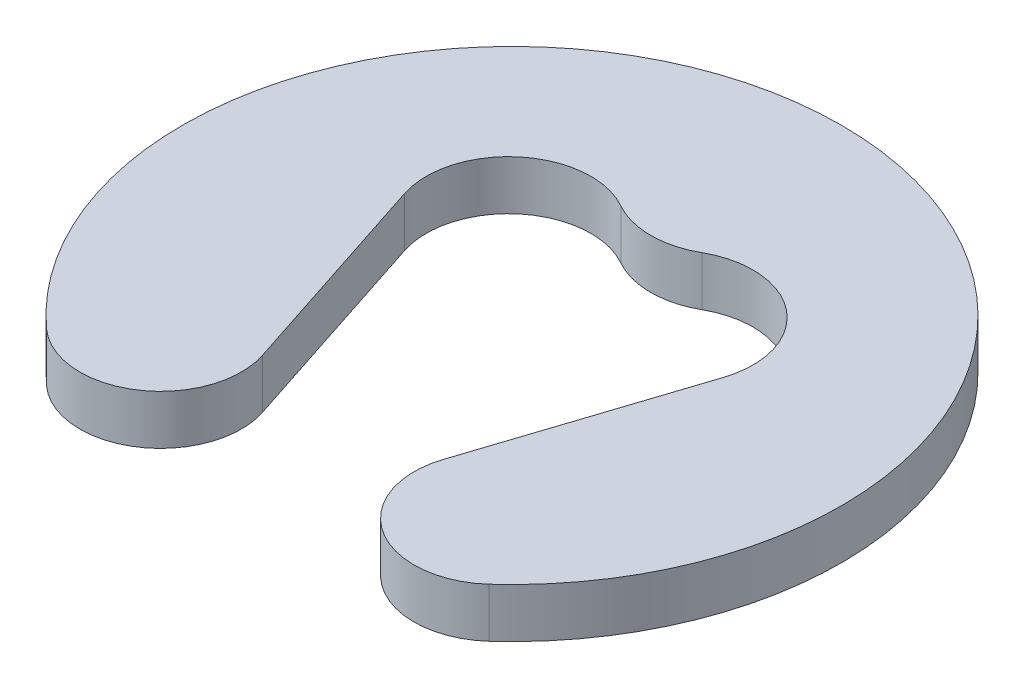
ISO-10303-21;
HEADER;
FILE_DESCRIPTION(('STEP AP214'),'2;1');
FILE_NAME('part.step','',(''),(''),'','','');
FILE_SCHEMA(('AUTOMOTIVE_DESIGN { 1 0 10303 214 1 1 1 1 }'));
ENDSEC;
DATA;
#1=APPLICATION_CONTEXT('core data for automotive mechanical design processes');
#2=APPLICATION_PROTOCOL_DEFINITION('international standard','automotive_design',2000,#1);
#3=PRODUCT_CONTEXT('',#1,'mechanical');
#4=PRODUCT('Part','Part','',(#3));
#5=PRODUCT_RELATED_PRODUCT_CATEGORY('part','',(#4));
#6=PRODUCT_DEFINITION_FORMATION('','',#4);
#7=PRODUCT_DEFINITION_CONTEXT('part definition',#1,'design');
#8=PRODUCT_DEFINITION('design','',#6,#7);
#9=PRODUCT_DEFINITION_SHAPE('','',#8);
#10=(LENGTH_UNIT() NAMED_UNIT(*) SI_UNIT(.MILLI.,.METRE.));
#11=(NAMED_UNIT(*) PLANE_ANGLE_UNIT() SI_UNIT($,.RADIAN.));
#12=(NAMED_UNIT(*) SI_UNIT($,.STERADIAN.) SOLID_ANGLE_UNIT());
#13=UNCERTAINTY_MEASURE_WITH_UNIT(LENGTH_MEASURE(1.E-05),#10,'distance_accuracy_value','');
#14=(GEOMETRIC_REPRESENTATION_CONTEXT(3) GLOBAL_UNCERTAINTY_ASSIGNED_CONTEXT((#13)) GLOBAL_UNIT_ASSIGNED_CONTEXT((#10,
#11,#12)) REPRESENTATION_CONTEXT('',''));
#15=CARTESIAN_POINT('',(0.,0.,0.));
#16=DIRECTION('',(0.,0.,1.));
#17=DIRECTION('',(1.,0.,0.));
#18=AXIS2_PLACEMENT_3D('',#15,#16,#17);
#19=CARTESIAN_POINT('',(0.,0.15,0.));
#20=DIRECTION('',(0.,1.,0.));
#21=DIRECTION('',(0.,0.,1.));
#22=AXIS2_PLACEMENT_3D('',#19,#20,#21);
#23=PLANE('',#22);
#24=CARTESIAN_POINT('',(0.,0.15,0.));
#25=DIRECTION('',(0.,1.,0.));
#26=DIRECTION('',(0.,0.,1.));
#27=AXIS2_PLACEMENT_3D('',#24,#25,#26);
#28=CIRCLE('',#27,2.);
#29=CARTESIAN_POINT('',(1.34323827989153,0.15,1.48179314461703));
#30=VERTEX_POINT('',#29);
#31=CARTESIAN_POINT('',(-1.34323827989153,0.15,1.48179314461703));
#32=VERTEX_POINT('',#31);
#33=EDGE_CURVE('E12',#30,#32,#28,.T.);
#34=ORIENTED_EDGE('',*,*,#33,.T.);
#35=CARTESIAN_POINT('',(-1.01399050348684,0.15,1.11858350023713));
#36=DIRECTION('',(0.,1.,0.));
#37=DIRECTION('',(0.,0.,1.));
#38=AXIS2_PLACEMENT_3D('',#35,#36,#37);
#39=CIRCLE('',#38,0.490229888968448);
#40=CARTESIAN_POINT('',(-0.548029650751403,0.15,0.966248908774503));
#41=VERTEX_POINT('',#40);
#42=EDGE_CURVE('E90',#32,#41,#39,.T.);
#43=ORIENTED_EDGE('',*,*,#42,.T.);
#44=DIRECTION('',(-0.310741133681523,0.,-0.950494580646477));
#45=VECTOR('',#44,1.);
#46=CARTESIAN_POINT('',(-0.780500995815256,0.15,0.255165857036482));
#47=LINE('',#46,#45);
#48=CARTESIAN_POINT('',(-0.967148548190199,0.15,-0.315751436472322));
#49=VERTEX_POINT('',#48);
#50=EDGE_CURVE('E154',#41,#49,#47,.T.);
#51=ORIENTED_EDGE('',*,*,#50,.T.);
#52=CARTESIAN_POINT('',(-0.49190125786696,0.15,-0.471122003313084));
#53=DIRECTION('',(0.,1.,0.));
#54=DIRECTION('',(0.,0.,1.));
#55=AXIS2_PLACEMENT_3D('',#52,#53,#54);
#56=CIRCLE('',#55,0.5);
#57=CARTESIAN_POINT('',(-0.24595062893348,0.15,-0.906447500070654));
#58=VERTEX_POINT('',#57);
#59=EDGE_CURVE('E127',#58,#49,#56,.T.);
#60=ORIENTED_EDGE('',*,*,#59,.F.);
#61=CARTESIAN_POINT('',(0.,0.15,-1.34177299682823));
#62=DIRECTION('',(0.,1.,0.));
#63=DIRECTION('',(0.,0.,1.));
#64=AXIS2_PLACEMENT_3D('',#61,#62,#63);
#65=CIRCLE('',#64,0.5);
#66=CARTESIAN_POINT('',(0.24595062893348,0.15,-0.906447500070654));
#67=VERTEX_POINT('',#66);
#68=EDGE_CURVE('E150',#58,#67,#65,.T.);
#69=ORIENTED_EDGE('',*,*,#68,.T.);
#70=CARTESIAN_POINT('',(0.49190125786696,0.15,-0.471122003313084));
#71=DIRECTION('',(0.,1.,0.));
#72=DIRECTION('',(0.,0.,1.));
#73=AXIS2_PLACEMENT_3D('',#70,#71,#72);
#74=CIRCLE('',#73,0.5);
#75=CARTESIAN_POINT('',(0.967148548190199,0.15,-0.315751436472322));
#76=VERTEX_POINT('',#75);
#77=EDGE_CURVE('E147',#67,#76,#74,.F.);
#78=ORIENTED_EDGE('',*,*,#77,.T.);
#79=DIRECTION('',(0.310741133681523,0.,-0.950494580646477));
#80=VECTOR('',#79,1.);
#81=CARTESIAN_POINT('',(0.780500995815256,0.15,0.255165857036482));
#82=LINE('',#81,#80);
#83=CARTESIAN_POINT('',(0.548029650751403,0.15,0.966248908774503));
#84=VERTEX_POINT('',#83);
#85=EDGE_CURVE('E144',#84,#76,#82,.T.);
#86=ORIENTED_EDGE('',*,*,#85,.F.);
#87=CARTESIAN_POINT('',(1.01399050348684,0.15,1.11858350023713));
#88=DIRECTION('',(0.,1.,0.));
#89=DIRECTION('',(0.,0.,1.));
#90=AXIS2_PLACEMENT_3D('',#87,#88,#89);
#91=CIRCLE('',#90,0.490229888968448);
#92=EDGE_CURVE('E141',#30,#84,#91,.F.);
#93=ORIENTED_EDGE('',*,*,#92,.F.);
#94=EDGE_LOOP('',(#34,#43,#51,#60,#69,#78,#86,#93));
#95=FACE_BOUND('',#94,.T.);
#96=ADVANCED_FACE('F38',(#95),#23,.T.);
#97=CARTESIAN_POINT('',(0.,-0.15,0.));
#98=DIRECTION('',(0.,1.,0.));
#99=DIRECTION('',(0.,0.,1.));
#100=AXIS2_PLACEMENT_3D('',#97,#98,#99);
#101=PLANE('',#100);
#102=CARTESIAN_POINT('',(-1.01399050348684,-0.15,1.11858350023713));
#103=DIRECTION('',(0.,1.,0.));
#104=DIRECTION('',(0.,0.,1.));
#105=AXIS2_PLACEMENT_3D('',#102,#103,#104);
#106=CIRCLE('',#105,0.490229888968448);
#107=CARTESIAN_POINT('',(-1.34323827989153,-0.15,1.48179314461703));
#108=VERTEX_POINT('',#107);
#109=CARTESIAN_POINT('',(-0.548029650751403,-0.15,0.966248908774503));
#110=VERTEX_POINT('',#109);
#111=EDGE_CURVE('E119',#108,#110,#106,.T.);
#112=ORIENTED_EDGE('',*,*,#111,.F.);
#113=CARTESIAN_POINT('',(0.,-0.15,0.));
#114=DIRECTION('',(0.,1.,0.));
#115=DIRECTION('',(0.,0.,1.));
#116=AXIS2_PLACEMENT_3D('',#113,#114,#115);
#117=CIRCLE('',#116,2.);
#118=CARTESIAN_POINT('',(1.34323827989153,-0.15,1.48179314461703));
#119=VERTEX_POINT('',#118);
#120=EDGE_CURVE('E42',#119,#108,#117,.T.);
#121=ORIENTED_EDGE('',*,*,#120,.F.);
#122=CARTESIAN_POINT('',(1.01399050348684,-0.15,1.11858350023713));
#123=DIRECTION('',(0.,1.,0.));
#124=DIRECTION('',(0.,0.,1.));
#125=AXIS2_PLACEMENT_3D('',#122,#123,#124);
#126=CIRCLE('',#125,0.490229888968448);
#127=CARTESIAN_POINT('',(0.548029650751402,-0.15,0.966248908774503));
#128=VERTEX_POINT('',#127);
#129=EDGE_CURVE('E96',#119,#128,#126,.F.);
#130=ORIENTED_EDGE('',*,*,#129,.T.);
#131=DIRECTION('',(0.310741133681523,0.,-0.950494580646477));
#132=VECTOR('',#131,1.);
#133=CARTESIAN_POINT('',(0.780500995815256,-0.15,0.255165857036482));
#134=LINE('',#133,#132);
#135=CARTESIAN_POINT('',(0.967148548190199,-0.15,-0.315751436472322));
#136=VERTEX_POINT('',#135);
#137=EDGE_CURVE('E53',#128,#136,#134,.T.);
#138=ORIENTED_EDGE('',*,*,#137,.T.);
#139=CARTESIAN_POINT('',(0.49190125786696,-0.15,-0.471122003313084));
#140=DIRECTION('',(0.,1.,0.));
#141=DIRECTION('',(0.,0.,1.));
#142=AXIS2_PLACEMENT_3D('',#139,#140,#141);
#143=CIRCLE('',#142,0.5);
#144=CARTESIAN_POINT('',(0.24595062893348,-0.15,-0.906447500070654));
#145=VERTEX_POINT('',#144);
#146=EDGE_CURVE('E135',#145,#136,#143,.F.);
#147=ORIENTED_EDGE('',*,*,#146,.F.);
#148=CARTESIAN_POINT('',(0.,-0.15,-1.34177299682823));
#149=DIRECTION('',(0.,1.,0.));
#150=DIRECTION('',(0.,0.,1.));
#151=AXIS2_PLACEMENT_3D('',#148,#149,#150);
#152=CIRCLE('',#151,0.5);
#153=CARTESIAN_POINT('',(-0.24595062893348,-0.15,-0.906447500070654));
#154=VERTEX_POINT('',#153);
#155=EDGE_CURVE('E133',#154,#145,#152,.T.);
#156=ORIENTED_EDGE('',*,*,#155,.F.);
#157=CARTESIAN_POINT('',(-0.49190125786696,-0.15,-0.471122003313084));
#158=DIRECTION('',(0.,1.,0.));
#159=DIRECTION('',(0.,0.,1.));
#160=AXIS2_PLACEMENT_3D('',#157,#158,#159);
#161=CIRCLE('',#160,0.5);
#162=CARTESIAN_POINT('',(-0.967148548190199,-0.15,-0.315751436472322));
#163=VERTEX_POINT('',#162);
#164=EDGE_CURVE('E120',#154,#163,#161,.T.);
#165=ORIENTED_EDGE('',*,*,#164,.T.);
#166=DIRECTION('',(-0.310741133681523,0.,-0.950494580646477));
#167=VECTOR('',#166,1.);
#168=CARTESIAN_POINT('',(-0.780500995815256,-0.15,0.255165857036482));
#169=LINE('',#168,#167);
#170=EDGE_CURVE('E110',#110,#163,#169,.T.);
#171=ORIENTED_EDGE('',*,*,#170,.F.);
#172=EDGE_LOOP('',(#112,#121,#130,#138,#147,#156,#165,#171));
#173=FACE_BOUND('',#172,.T.);
#174=ADVANCED_FACE('F131',(#173),#101,.F.);
#175=CARTESIAN_POINT('',(0.,0.15,0.));
#176=DIRECTION('',(0.,-1.,0.));
#177=DIRECTION('',(0.,0.,-1.));
#178=AXIS2_PLACEMENT_3D('',#175,#176,#177);
#179=CYLINDRICAL_SURFACE('',#178,2.);
#180=ORIENTED_EDGE('',*,*,#120,.T.);
#181=DIRECTION('',(0.,1.,0.));
#182=VECTOR('',#181,1.);
#183=CARTESIAN_POINT('',(-1.34323827989153,-0.15,1.48179314461703));
#184=LINE('',#183,#182);
#185=EDGE_CURVE('E62',#108,#32,#184,.T.);
#186=ORIENTED_EDGE('',*,*,#185,.T.);
#187=ORIENTED_EDGE('',*,*,#33,.F.);
#188=DIRECTION('',(0.,1.,0.));
#189=VECTOR('',#188,1.);
#190=CARTESIAN_POINT('',(1.34323827989153,-0.15,1.48179314461703));
#191=LINE('',#190,#189);
#192=EDGE_CURVE('E140',#119,#30,#191,.T.);
#193=ORIENTED_EDGE('',*,*,#192,.F.);
#194=EDGE_LOOP('',(#180,#186,#187,#193));
#195=FACE_BOUND('',#194,.T.);
#196=ADVANCED_FACE('F40',(#195),#179,.T.);
#197=CARTESIAN_POINT('',(-1.01399050348684,-0.15,1.11858350023713));
#198=DIRECTION('',(0.,1.,0.));
#199=DIRECTION('',(0.,0.,1.));
#200=AXIS2_PLACEMENT_3D('',#197,#198,#199);
#201=CYLINDRICAL_SURFACE('',#200,0.490229888968448);
#202=ORIENTED_EDGE('',*,*,#42,.F.);
#203=ORIENTED_EDGE('',*,*,#185,.F.);
#204=ORIENTED_EDGE('',*,*,#111,.T.);
#205=DIRECTION('',(0.,1.,0.));
#206=VECTOR('',#205,1.);
#207=CARTESIAN_POINT('',(-0.548029650751403,-0.15,0.966248908774503));
#208=LINE('',#207,#206);
#209=EDGE_CURVE('E116',#110,#41,#208,.T.);
#210=ORIENTED_EDGE('',*,*,#209,.T.);
#211=EDGE_LOOP('',(#202,#203,#204,#210));
#212=FACE_BOUND('',#211,.T.);
#213=ADVANCED_FACE('F174',(#212),#201,.T.);
#214=CARTESIAN_POINT('',(-0.780500995815256,-0.15,0.255165857036482));
#215=DIRECTION('',(0.950494580646477,0.,-0.310741133681523));
#216=DIRECTION('',(-0.310741133681523,0.,-0.950494580646477));
#217=AXIS2_PLACEMENT_3D('',#214,#215,#216);
#218=PLANE('',#217);
#219=ORIENTED_EDGE('',*,*,#50,.F.);
#220=ORIENTED_EDGE('',*,*,#209,.F.);
#221=ORIENTED_EDGE('',*,*,#170,.T.);
#222=DIRECTION('',(0.,1.,0.));
#223=VECTOR('',#222,1.);
#224=CARTESIAN_POINT('',(-0.967148548190199,-0.15,-0.315751436472322));
#225=LINE('',#224,#223);
#226=EDGE_CURVE('E114',#163,#49,#225,.T.);
#227=ORIENTED_EDGE('',*,*,#226,.T.);
#228=EDGE_LOOP('',(#219,#220,#221,#227));
#229=FACE_BOUND('',#228,.T.);
#230=ADVANCED_FACE('F113',(#229),#218,.T.);
#231=CARTESIAN_POINT('',(-0.49190125786696,-0.15,-0.471122003313084));
#232=DIRECTION('',(0.,1.,0.));
#233=DIRECTION('',(0.,0.,1.));
#234=AXIS2_PLACEMENT_3D('',#231,#232,#233);
#235=CYLINDRICAL_SURFACE('',#234,0.5);
#236=ORIENTED_EDGE('',*,*,#59,.T.);
#237=ORIENTED_EDGE('',*,*,#226,.F.);
#238=ORIENTED_EDGE('',*,*,#164,.F.);
#239=DIRECTION('',(0.,1.,0.));
#240=VECTOR('',#239,1.);
#241=CARTESIAN_POINT('',(-0.24595062893348,-0.15,-0.906447500070654));
#242=LINE('',#241,#240);
#243=EDGE_CURVE('E129',#154,#58,#242,.T.);
#244=ORIENTED_EDGE('',*,*,#243,.T.);
#245=EDGE_LOOP('',(#236,#237,#238,#244));
#246=FACE_BOUND('',#245,.T.);
#247=ADVANCED_FACE('F124',(#246),#235,.F.);
#248=CARTESIAN_POINT('',(0.,-0.15,-1.34177299682823));
#249=DIRECTION('',(0.,1.,0.));
#250=DIRECTION('',(0.,0.,1.));
#251=AXIS2_PLACEMENT_3D('',#248,#249,#250);
#252=CYLINDRICAL_SURFACE('',#251,0.5);
#253=ORIENTED_EDGE('',*,*,#68,.F.);
#254=ORIENTED_EDGE('',*,*,#243,.F.);
#255=ORIENTED_EDGE('',*,*,#155,.T.);
#256=DIRECTION('',(0.,1.,0.));
#257=VECTOR('',#256,1.);
#258=CARTESIAN_POINT('',(0.24595062893348,-0.15,-0.906447500070654));
#259=LINE('',#258,#257);
#260=EDGE_CURVE('E160',#145,#67,#259,.T.);
#261=ORIENTED_EDGE('',*,*,#260,.T.);
#262=EDGE_LOOP('',(#253,#254,#255,#261));
#263=FACE_BOUND('',#262,.T.);
#264=ADVANCED_FACE('F178',(#263),#252,.T.);
#265=CARTESIAN_POINT('',(0.49190125786696,-0.15,-0.471122003313084));
#266=DIRECTION('',(0.,1.,0.));
#267=DIRECTION('',(0.,0.,1.));
#268=AXIS2_PLACEMENT_3D('',#265,#266,#267);
#269=CYLINDRICAL_SURFACE('',#268,0.5);
#270=ORIENTED_EDGE('',*,*,#77,.F.);
#271=ORIENTED_EDGE('',*,*,#260,.F.);
#272=ORIENTED_EDGE('',*,*,#146,.T.);
#273=DIRECTION('',(0.,1.,0.));
#274=VECTOR('',#273,1.);
#275=CARTESIAN_POINT('',(0.967148548190199,-0.15,-0.315751436472322));
#276=LINE('',#275,#274);
#277=EDGE_CURVE('E162',#136,#76,#276,.T.);
#278=ORIENTED_EDGE('',*,*,#277,.T.);
#279=EDGE_LOOP('',(#270,#271,#272,#278));
#280=FACE_BOUND('',#279,.T.);
#281=ADVANCED_FACE('F181',(#280),#269,.F.);
#282=CARTESIAN_POINT('',(0.780500995815256,-0.15,0.255165857036482));
#283=DIRECTION('',(0.950494580646477,0.,0.310741133681523));
#284=DIRECTION('',(0.310741133681523,0.,-0.950494580646477));
#285=AXIS2_PLACEMENT_3D('',#282,#283,#284);
#286=PLANE('',#285);
#287=ORIENTED_EDGE('',*,*,#85,.T.);
#288=ORIENTED_EDGE('',*,*,#277,.F.);
#289=ORIENTED_EDGE('',*,*,#137,.F.);
#290=DIRECTION('',(0.,1.,0.));
#291=VECTOR('',#290,1.);
#292=CARTESIAN_POINT('',(0.548029650751403,-0.15,0.966248908774503));
#293=LINE('',#292,#291);
#294=EDGE_CURVE('E164',#128,#84,#293,.T.);
#295=ORIENTED_EDGE('',*,*,#294,.T.);
#296=EDGE_LOOP('',(#287,#288,#289,#295));
#297=FACE_BOUND('',#296,.T.);
#298=ADVANCED_FACE('F182',(#297),#286,.F.);
#299=CARTESIAN_POINT('',(1.01399050348684,-0.15,1.11858350023713));
#300=DIRECTION('',(0.,1.,0.));
#301=DIRECTION('',(0.,0.,1.));
#302=AXIS2_PLACEMENT_3D('',#299,#300,#301);
#303=CYLINDRICAL_SURFACE('',#302,0.490229888968448);
#304=ORIENTED_EDGE('',*,*,#92,.T.);
#305=ORIENTED_EDGE('',*,*,#294,.F.);
#306=ORIENTED_EDGE('',*,*,#129,.F.);
#307=ORIENTED_EDGE('',*,*,#192,.T.);
#308=EDGE_LOOP('',(#304,#305,#306,#307));
#309=FACE_BOUND('',#308,.T.);
#310=ADVANCED_FACE('F167',(#309),#303,.T.);
#311=CLOSED_SHELL('',(#96,#174,#196,#213,#230,#247,#264,#281,#298,#310));
#312=MANIFOLD_SOLID_BREP('B2',#311);
#313=ADVANCED_BREP_SHAPE_REPRESENTATION('',(#18,#312),#14);
#314=SHAPE_DEFINITION_REPRESENTATION(#9,#313);
ENDSEC;
END-ISO-10303-21;
